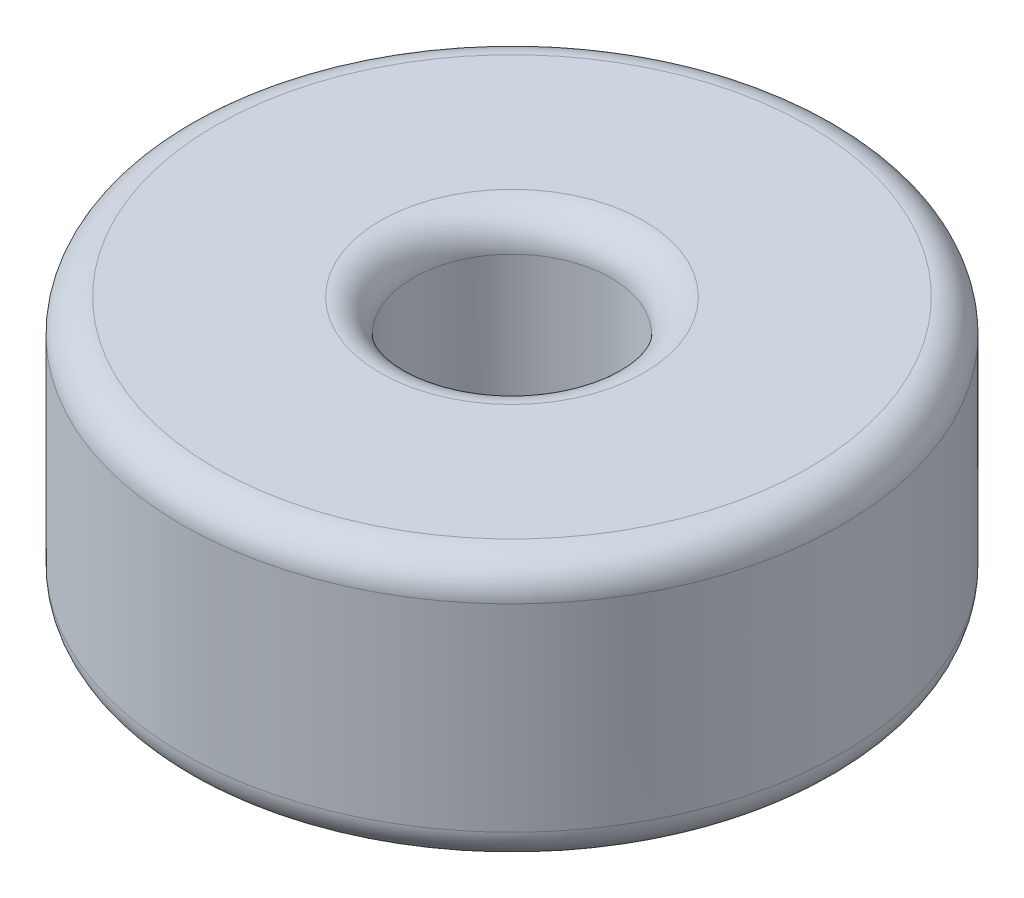
ISO-10303-21;
HEADER;
FILE_DESCRIPTION(('STEP AP214'),'2;1');
FILE_NAME('part.step','',(''),(''),'','','');
FILE_SCHEMA(('AUTOMOTIVE_DESIGN { 1 0 10303 214 1 1 1 1 }'));
ENDSEC;
DATA;
#1=APPLICATION_CONTEXT('core data for automotive mechanical design processes');
#2=APPLICATION_PROTOCOL_DEFINITION('international standard','automotive_design',2000,#1);
#3=PRODUCT_CONTEXT('',#1,'mechanical');
#4=PRODUCT('Part','Part','',(#3));
#5=PRODUCT_RELATED_PRODUCT_CATEGORY('part','',(#4));
#6=PRODUCT_DEFINITION_FORMATION('','',#4);
#7=PRODUCT_DEFINITION_CONTEXT('part definition',#1,'design');
#8=PRODUCT_DEFINITION('design','',#6,#7);
#9=PRODUCT_DEFINITION_SHAPE('','',#8);
#10=(LENGTH_UNIT() NAMED_UNIT(*) SI_UNIT(.MILLI.,.METRE.));
#11=(NAMED_UNIT(*) PLANE_ANGLE_UNIT() SI_UNIT($,.RADIAN.));
#12=(NAMED_UNIT(*) SI_UNIT($,.STERADIAN.) SOLID_ANGLE_UNIT());
#13=UNCERTAINTY_MEASURE_WITH_UNIT(LENGTH_MEASURE(1.E-05),#10,'distance_accuracy_value','');
#14=(GEOMETRIC_REPRESENTATION_CONTEXT(3) GLOBAL_UNCERTAINTY_ASSIGNED_CONTEXT((#13)) GLOBAL_UNIT_ASSIGNED_CONTEXT((#10,
#11,#12)) REPRESENTATION_CONTEXT('',''));
#15=CARTESIAN_POINT('',(0.,0.,0.));
#16=DIRECTION('',(0.,0.,1.));
#17=DIRECTION('',(1.,0.,0.));
#18=AXIS2_PLACEMENT_3D('',#15,#16,#17);
#19=CARTESIAN_POINT('',(0.,0.,0.));
#20=DIRECTION('',(0.,-1.,0.));
#21=DIRECTION('',(0.,0.,-1.));
#22=AXIS2_PLACEMENT_3D('',#19,#20,#21);
#23=CYLINDRICAL_SURFACE('',#22,1.5);
#24=CARTESIAN_POINT('',(0.,0.5,0.));
#25=DIRECTION('',(0.,-1.,0.));
#26=DIRECTION('',(0.,0.,-1.));
#27=AXIS2_PLACEMENT_3D('',#24,#25,#26);
#28=CIRCLE('',#27,1.5);
#29=CARTESIAN_POINT('',(0.,0.5,-1.5));
#30=VERTEX_POINT('',#29);
#31=EDGE_CURVE('E58',#30,#30,#28,.T.);
#32=ORIENTED_EDGE('',*,*,#31,.T.);
#33=EDGE_LOOP('',(#32));
#34=FACE_BOUND('',#33,.T.);
#35=CARTESIAN_POINT('',(0.,3.5,0.));
#36=DIRECTION('',(0.,1.,0.));
#37=DIRECTION('',(0.,0.,1.));
#38=AXIS2_PLACEMENT_3D('',#35,#36,#37);
#39=CIRCLE('',#38,1.5);
#40=CARTESIAN_POINT('',(0.,3.5,1.5));
#41=VERTEX_POINT('',#40);
#42=EDGE_CURVE('E61',#41,#41,#39,.T.);
#43=ORIENTED_EDGE('',*,*,#42,.T.);
#44=EDGE_LOOP('',(#43));
#45=FACE_BOUND('',#44,.T.);
#46=ADVANCED_FACE('F32',(#34,#45),#23,.F.);
#47=CARTESIAN_POINT('',(1.5,4.,0.));
#48=DIRECTION('',(0.,1.,0.));
#49=DIRECTION('',(0.,0.,1.));
#50=AXIS2_PLACEMENT_3D('',#47,#48,#49);
#51=PLANE('',#50);
#52=CARTESIAN_POINT('',(0.,4.,0.));
#53=DIRECTION('',(0.,1.,0.));
#54=DIRECTION('',(0.,0.,1.));
#55=AXIS2_PLACEMENT_3D('',#52,#53,#54);
#56=CIRCLE('',#55,4.5);
#57=CARTESIAN_POINT('',(0.,4.,4.5));
#58=VERTEX_POINT('',#57);
#59=EDGE_CURVE('E10',#58,#58,#56,.T.);
#60=ORIENTED_EDGE('',*,*,#59,.T.);
#61=EDGE_LOOP('',(#60));
#62=FACE_BOUND('',#61,.T.);
#63=CARTESIAN_POINT('',(0.,4.,0.));
#64=DIRECTION('',(0.,1.,0.));
#65=DIRECTION('',(0.,0.,1.));
#66=AXIS2_PLACEMENT_3D('',#63,#64,#65);
#67=CIRCLE('',#66,2.);
#68=CARTESIAN_POINT('',(0.,4.,2.));
#69=VERTEX_POINT('',#68);
#70=EDGE_CURVE('E39',#69,#69,#67,.F.);
#71=ORIENTED_EDGE('',*,*,#70,.T.);
#72=EDGE_LOOP('',(#71));
#73=FACE_BOUND('',#72,.T.);
#74=ADVANCED_FACE('F75',(#62,#73),#51,.T.);
#75=CARTESIAN_POINT('',(0.,0.,0.));
#76=DIRECTION('',(0.,-1.,0.));
#77=DIRECTION('',(0.,0.,-1.));
#78=AXIS2_PLACEMENT_3D('',#75,#76,#77);
#79=CYLINDRICAL_SURFACE('',#78,5.);
#80=CARTESIAN_POINT('',(0.,0.5,0.));
#81=DIRECTION('',(0.,-1.,0.));
#82=DIRECTION('',(0.,0.,-1.));
#83=AXIS2_PLACEMENT_3D('',#80,#81,#82);
#84=CIRCLE('',#83,5.);
#85=CARTESIAN_POINT('',(0.,0.5,-5.));
#86=VERTEX_POINT('',#85);
#87=EDGE_CURVE('E43',#86,#86,#84,.F.);
#88=ORIENTED_EDGE('',*,*,#87,.T.);
#89=EDGE_LOOP('',(#88));
#90=FACE_BOUND('',#89,.T.);
#91=CARTESIAN_POINT('',(0.,3.5,0.));
#92=DIRECTION('',(0.,1.,0.));
#93=DIRECTION('',(0.,0.,1.));
#94=AXIS2_PLACEMENT_3D('',#91,#92,#93);
#95=CIRCLE('',#94,5.);
#96=CARTESIAN_POINT('',(0.,3.5,5.));
#97=VERTEX_POINT('',#96);
#98=EDGE_CURVE('E47',#97,#97,#95,.F.);
#99=ORIENTED_EDGE('',*,*,#98,.T.);
#100=EDGE_LOOP('',(#99));
#101=FACE_BOUND('',#100,.T.);
#102=ADVANCED_FACE('F81',(#90,#101),#79,.T.);
#103=CARTESIAN_POINT('',(1.5,0.,0.));
#104=DIRECTION('',(0.,-1.,0.));
#105=DIRECTION('',(0.,0.,-1.));
#106=AXIS2_PLACEMENT_3D('',#103,#104,#105);
#107=PLANE('',#106);
#108=CARTESIAN_POINT('',(0.,0.,0.));
#109=DIRECTION('',(0.,-1.,0.));
#110=DIRECTION('',(0.,0.,-1.));
#111=AXIS2_PLACEMENT_3D('',#108,#109,#110);
#112=CIRCLE('',#111,2.);
#113=CARTESIAN_POINT('',(0.,0.,-2.));
#114=VERTEX_POINT('',#113);
#115=EDGE_CURVE('E52',#114,#114,#112,.F.);
#116=ORIENTED_EDGE('',*,*,#115,.T.);
#117=EDGE_LOOP('',(#116));
#118=FACE_BOUND('',#117,.T.);
#119=CARTESIAN_POINT('',(0.,0.,0.));
#120=DIRECTION('',(0.,-1.,0.));
#121=DIRECTION('',(0.,0.,-1.));
#122=AXIS2_PLACEMENT_3D('',#119,#120,#121);
#123=CIRCLE('',#122,4.5);
#124=CARTESIAN_POINT('',(0.,0.,-4.5));
#125=VERTEX_POINT('',#124);
#126=EDGE_CURVE('E55',#125,#125,#123,.T.);
#127=ORIENTED_EDGE('',*,*,#126,.T.);
#128=EDGE_LOOP('',(#127));
#129=FACE_BOUND('',#128,.T.);
#130=ADVANCED_FACE('F88',(#118,#129),#107,.T.);
#131=CARTESIAN_POINT('',(0.,0.5,0.));
#132=DIRECTION('',(0.,-1.,0.));
#133=DIRECTION('',(0.,0.,-1.));
#134=AXIS2_PLACEMENT_3D('',#131,#132,#133);
#135=TOROIDAL_SURFACE('',#134,2.,0.5);
#136=ORIENTED_EDGE('',*,*,#115,.F.);
#137=EDGE_LOOP('',(#136));
#138=FACE_BOUND('',#137,.T.);
#139=ORIENTED_EDGE('',*,*,#31,.F.);
#140=EDGE_LOOP('',(#139));
#141=FACE_BOUND('',#140,.T.);
#142=ADVANCED_FACE('F85',(#138,#141),#135,.T.);
#143=CARTESIAN_POINT('',(0.,0.5,0.));
#144=DIRECTION('',(0.,-1.,0.));
#145=DIRECTION('',(0.,0.,-1.));
#146=AXIS2_PLACEMENT_3D('',#143,#144,#145);
#147=TOROIDAL_SURFACE('',#146,4.5,0.5);
#148=ORIENTED_EDGE('',*,*,#87,.F.);
#149=EDGE_LOOP('',(#148));
#150=FACE_BOUND('',#149,.T.);
#151=ORIENTED_EDGE('',*,*,#126,.F.);
#152=EDGE_LOOP('',(#151));
#153=FACE_BOUND('',#152,.T.);
#154=ADVANCED_FACE('F72',(#150,#153),#147,.T.);
#155=CARTESIAN_POINT('',(0.,3.5,0.));
#156=DIRECTION('',(0.,1.,0.));
#157=DIRECTION('',(0.,0.,1.));
#158=AXIS2_PLACEMENT_3D('',#155,#156,#157);
#159=TOROIDAL_SURFACE('',#158,4.5,0.5);
#160=ORIENTED_EDGE('',*,*,#59,.F.);
#161=EDGE_LOOP('',(#160));
#162=FACE_BOUND('',#161,.T.);
#163=ORIENTED_EDGE('',*,*,#98,.F.);
#164=EDGE_LOOP('',(#163));
#165=FACE_BOUND('',#164,.T.);
#166=ADVANCED_FACE('F68',(#162,#165),#159,.T.);
#167=CARTESIAN_POINT('',(0.,3.5,0.));
#168=DIRECTION('',(0.,1.,0.));
#169=DIRECTION('',(0.,0.,1.));
#170=AXIS2_PLACEMENT_3D('',#167,#168,#169);
#171=TOROIDAL_SURFACE('',#170,2.,0.5);
#172=ORIENTED_EDGE('',*,*,#42,.F.);
#173=EDGE_LOOP('',(#172));
#174=FACE_BOUND('',#173,.T.);
#175=ORIENTED_EDGE('',*,*,#70,.F.);
#176=EDGE_LOOP('',(#175));
#177=FACE_BOUND('',#176,.T.);
#178=ADVANCED_FACE('F34',(#174,#177),#171,.T.);
#179=CLOSED_SHELL('',(#46,#74,#102,#130,#142,#154,#166,#178));
#180=MANIFOLD_SOLID_BREP('B2',#179);
#181=ADVANCED_BREP_SHAPE_REPRESENTATION('',(#18,#180),#14);
#182=SHAPE_DEFINITION_REPRESENTATION(#9,#181);
ENDSEC;
END-ISO-10303-21;
